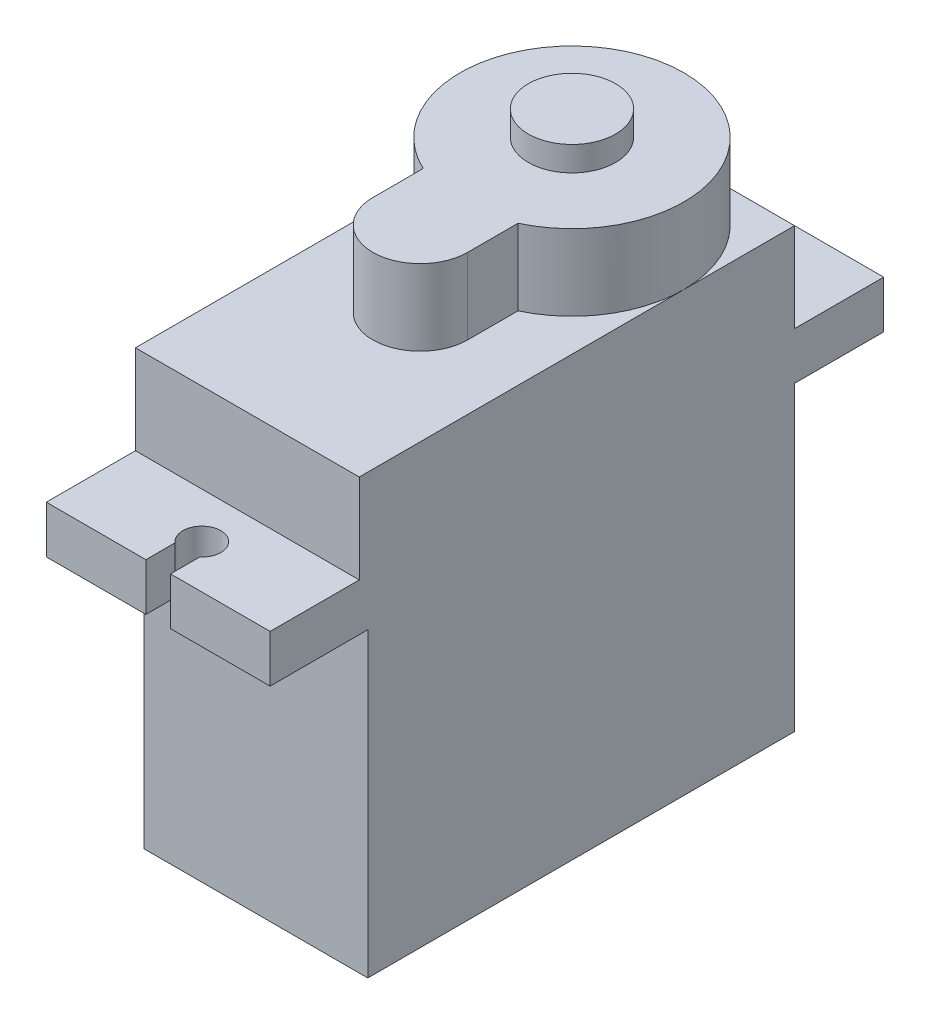
ISO-10303-21;
HEADER;
FILE_DESCRIPTION(('STEP AP214'),'2;1');
FILE_NAME('part.step','',(''),(''),'','','');
FILE_SCHEMA(('AUTOMOTIVE_DESIGN { 1 0 10303 214 1 1 1 1 }'));
ENDSEC;
DATA;
#1=APPLICATION_CONTEXT('core data for automotive mechanical design processes');
#2=APPLICATION_PROTOCOL_DEFINITION('international standard','automotive_design',2000,#1);
#3=PRODUCT_CONTEXT('',#1,'mechanical');
#4=PRODUCT('Part','Part','',(#3));
#5=PRODUCT_RELATED_PRODUCT_CATEGORY('part','',(#4));
#6=PRODUCT_DEFINITION_FORMATION('','',#4);
#7=PRODUCT_DEFINITION_CONTEXT('part definition',#1,'design');
#8=PRODUCT_DEFINITION('design','',#6,#7);
#9=PRODUCT_DEFINITION_SHAPE('','',#8);
#10=(LENGTH_UNIT() NAMED_UNIT(*) SI_UNIT(.MILLI.,.METRE.));
#11=(NAMED_UNIT(*) PLANE_ANGLE_UNIT() SI_UNIT($,.RADIAN.));
#12=(NAMED_UNIT(*) SI_UNIT($,.STERADIAN.) SOLID_ANGLE_UNIT());
#13=UNCERTAINTY_MEASURE_WITH_UNIT(LENGTH_MEASURE(1.E-05),#10,'distance_accuracy_value','');
#14=(GEOMETRIC_REPRESENTATION_CONTEXT(3) GLOBAL_UNCERTAINTY_ASSIGNED_CONTEXT((#13)) GLOBAL_UNIT_ASSIGNED_CONTEXT((#10,
#11,#12)) REPRESENTATION_CONTEXT('',''));
#15=CARTESIAN_POINT('',(0.,0.,0.));
#16=DIRECTION('',(0.,0.,1.));
#17=DIRECTION('',(1.,0.,0.));
#18=AXIS2_PLACEMENT_3D('',#15,#16,#17);
#19=CARTESIAN_POINT('',(11.8,18.4,-2.28295744158988));
#20=DIRECTION('',(0.,0.,-1.));
#21=DIRECTION('',(-1.,0.,0.));
#22=AXIS2_PLACEMENT_3D('',#19,#20,#21);
#23=PLANE('',#22);
#24=DIRECTION('',(-1.,0.,0.));
#25=VECTOR('',#24,1.);
#26=CARTESIAN_POINT('',(11.8,18.4,-2.28295744158988));
#27=LINE('',#26,#25);
#28=CARTESIAN_POINT('',(11.8,18.4,-2.28295744158988));
#29=VERTEX_POINT('',#28);
#30=CARTESIAN_POINT('',(6.55,18.4,-2.28295744158988));
#31=VERTEX_POINT('',#30);
#32=EDGE_CURVE('E369',#29,#31,#27,.T.);
#33=ORIENTED_EDGE('',*,*,#32,.T.);
#34=DIRECTION('',(0.,1.,0.));
#35=VECTOR('',#34,1.);
#36=CARTESIAN_POINT('',(6.55,8.4,-2.28295744158988));
#37=LINE('',#36,#35);
#38=CARTESIAN_POINT('',(6.55,15.9,-2.28295744158988));
#39=VERTEX_POINT('',#38);
#40=EDGE_CURVE('E225',#39,#31,#37,.T.);
#41=ORIENTED_EDGE('',*,*,#40,.F.);
#42=DIRECTION('',(-1.,0.,0.));
#43=VECTOR('',#42,1.);
#44=CARTESIAN_POINT('',(11.8,15.9,-2.28295744158988));
#45=LINE('',#44,#43);
#46=CARTESIAN_POINT('',(11.8,15.9,-2.28295744158988));
#47=VERTEX_POINT('',#46);
#48=EDGE_CURVE('E365',#47,#39,#45,.T.);
#49=ORIENTED_EDGE('',*,*,#48,.F.);
#50=DIRECTION('',(0.,-1.,0.));
#51=VECTOR('',#50,1.);
#52=CARTESIAN_POINT('',(11.8,18.4,-2.28295744158988));
#53=LINE('',#52,#51);
#54=EDGE_CURVE('E327',#29,#47,#53,.T.);
#55=ORIENTED_EDGE('',*,*,#54,.F.);
#56=EDGE_LOOP('',(#33,#41,#49,#55));
#57=FACE_BOUND('',#56,.T.);
#58=ADVANCED_FACE('F37',(#57),#23,.F.);
#59=CARTESIAN_POINT('',(11.8,15.9,-34.6322917276657));
#60=DIRECTION('',(0.,0.,1.));
#61=DIRECTION('',(1.,0.,0.));
#62=AXIS2_PLACEMENT_3D('',#59,#60,#61);
#63=PLANE('',#62);
#64=DIRECTION('',(-1.,0.,0.));
#65=VECTOR('',#64,1.);
#66=CARTESIAN_POINT('',(11.8,15.9,-34.6322917276657));
#67=LINE('',#66,#65);
#68=CARTESIAN_POINT('',(11.8,15.9,-34.6322917276657));
#69=VERTEX_POINT('',#68);
#70=CARTESIAN_POINT('',(6.55,15.9,-34.6322917276657));
#71=VERTEX_POINT('',#70);
#72=EDGE_CURVE('E390',#69,#71,#67,.T.);
#73=ORIENTED_EDGE('',*,*,#72,.T.);
#74=DIRECTION('',(0.,1.,0.));
#75=VECTOR('',#74,1.);
#76=CARTESIAN_POINT('',(6.55,8.4,-34.6322917276657));
#77=LINE('',#76,#75);
#78=CARTESIAN_POINT('',(6.55,18.4,-34.6322917276657));
#79=VERTEX_POINT('',#78);
#80=EDGE_CURVE('E247',#71,#79,#77,.T.);
#81=ORIENTED_EDGE('',*,*,#80,.T.);
#82=DIRECTION('',(-1.,0.,0.));
#83=VECTOR('',#82,1.);
#84=CARTESIAN_POINT('',(11.8,18.4,-34.6322917276657));
#85=LINE('',#84,#83);
#86=CARTESIAN_POINT('',(11.8,18.4,-34.6322917276657));
#87=VERTEX_POINT('',#86);
#88=EDGE_CURVE('E386',#87,#79,#85,.T.);
#89=ORIENTED_EDGE('',*,*,#88,.F.);
#90=DIRECTION('',(0.,1.,0.));
#91=VECTOR('',#90,1.);
#92=CARTESIAN_POINT('',(11.8,15.9,-34.6322917276657));
#93=LINE('',#92,#91);
#94=EDGE_CURVE('E313',#69,#87,#93,.T.);
#95=ORIENTED_EDGE('',*,*,#94,.F.);
#96=EDGE_LOOP('',(#73,#81,#89,#95));
#97=FACE_BOUND('',#96,.T.);
#98=ADVANCED_FACE('F480',(#97),#63,.F.);
#99=CARTESIAN_POINT('',(5.9,27.1,-16.0980374377126));
#100=DIRECTION('',(0.,1.,0.));
#101=DIRECTION('',(0.,0.,1.));
#102=AXIS2_PLACEMENT_3D('',#99,#100,#101);
#103=PLANE('',#102);
#104=CARTESIAN_POINT('',(5.9,27.1,-16.0980374377126));
#105=DIRECTION('',(0.,1.,0.));
#106=DIRECTION('',(0.,0.,1.));
#107=AXIS2_PLACEMENT_3D('',#104,#105,#106);
#108=CIRCLE('',#107,2.5);
#109=CARTESIAN_POINT('',(3.4,27.1,-16.0980374377126));
#110=VERTEX_POINT('',#109);
#111=CARTESIAN_POINT('',(8.4,27.1,-16.0980374377126));
#112=VERTEX_POINT('',#111);
#113=EDGE_CURVE('E267',#110,#112,#108,.T.);
#114=ORIENTED_EDGE('',*,*,#113,.T.);
#115=DIRECTION('',(0.,0.,-1.));
#116=VECTOR('',#115,1.);
#117=CARTESIAN_POINT('',(8.4,27.1,-16.0980374377126));
#118=LINE('',#117,#116);
#119=CARTESIAN_POINT('',(8.4,27.1,-18.7538817513576));
#120=VERTEX_POINT('',#119);
#121=EDGE_CURVE('E270',#112,#120,#118,.T.);
#122=ORIENTED_EDGE('',*,*,#121,.T.);
#123=CARTESIAN_POINT('',(5.9,27.1,-24.0980374377126));
#124=DIRECTION('',(0.,1.,0.));
#125=DIRECTION('',(0.,0.,1.));
#126=AXIS2_PLACEMENT_3D('',#123,#124,#125);
#127=CIRCLE('',#126,5.9);
#128=CARTESIAN_POINT('',(3.4,27.1,-18.7538817513576));
#129=VERTEX_POINT('',#128);
#130=EDGE_CURVE('E273',#120,#129,#127,.T.);
#131=ORIENTED_EDGE('',*,*,#130,.T.);
#132=DIRECTION('',(0.,0.,1.));
#133=VECTOR('',#132,1.);
#134=CARTESIAN_POINT('',(3.4,27.1,-16.0980374377126));
#135=LINE('',#134,#133);
#136=EDGE_CURVE('E275',#129,#110,#135,.T.);
#137=ORIENTED_EDGE('',*,*,#136,.T.);
#138=EDGE_LOOP('',(#114,#122,#131,#137));
#139=FACE_BOUND('',#138,.T.);
#140=CARTESIAN_POINT('',(5.9,27.1,-24.0980374377126));
#141=DIRECTION('',(0.,1.,0.));
#142=DIRECTION('',(0.,0.,1.));
#143=AXIS2_PLACEMENT_3D('',#140,#141,#142);
#144=CIRCLE('',#143,2.3);
#145=CARTESIAN_POINT('',(5.9,27.1,-21.7980374377126));
#146=VERTEX_POINT('',#145);
#147=EDGE_CURVE('E264',#146,#146,#144,.T.);
#148=ORIENTED_EDGE('',*,*,#147,.F.);
#149=EDGE_LOOP('',(#148));
#150=FACE_BOUND('',#149,.T.);
#151=ADVANCED_FACE('F485',(#139,#150),#103,.T.);
#152=CARTESIAN_POINT('',(11.8,23.1,-29.9322917276657));
#153=DIRECTION('',(0.,-1.,0.));
#154=DIRECTION('',(0.,0.,-1.));
#155=AXIS2_PLACEMENT_3D('',#152,#153,#154);
#156=PLANE('',#155);
#157=CARTESIAN_POINT('',(5.9,23.1,-24.0980374377126));
#158=DIRECTION('',(0.,1.,0.));
#159=DIRECTION('',(0.,0.,1.));
#160=AXIS2_PLACEMENT_3D('',#157,#158,#159);
#161=CIRCLE('',#160,5.9);
#162=CARTESIAN_POINT('',(5.02166243381931,23.1,-29.9322917276657));
#163=VERTEX_POINT('',#162);
#164=CARTESIAN_POINT('',(0.,23.1,-24.0980374377126));
#165=VERTEX_POINT('',#164);
#166=EDGE_CURVE('E403',#163,#165,#161,.T.);
#167=ORIENTED_EDGE('',*,*,#166,.F.);
#168=DIRECTION('',(-1.,0.,0.));
#169=VECTOR('',#168,1.);
#170=CARTESIAN_POINT('',(11.8,23.1,-29.9322917276657));
#171=LINE('',#170,#169);
#172=CARTESIAN_POINT('',(0.,23.1,-29.9322917276657));
#173=VERTEX_POINT('',#172);
#174=EDGE_CURVE('E377',#163,#173,#171,.T.);
#175=ORIENTED_EDGE('',*,*,#174,.T.);
#176=DIRECTION('',(0.,0.,1.));
#177=VECTOR('',#176,1.);
#178=CARTESIAN_POINT('',(0.,23.1,-29.9322917276657));
#179=LINE('',#178,#177);
#180=EDGE_CURVE('E350',#173,#165,#179,.T.);
#181=ORIENTED_EDGE('',*,*,#180,.T.);
#182=EDGE_LOOP('',(#167,#175,#181));
#183=FACE_BOUND('',#182,.T.);
#184=ADVANCED_FACE('F443',(#183),#156,.F.);
#185=CARTESIAN_POINT('',(3.4,23.1,-18.7538817513576));
#186=VERTEX_POINT('',#185);
#187=EDGE_CURVE('E450',#165,#186,#161,.T.);
#188=ORIENTED_EDGE('',*,*,#187,.F.);
#189=CARTESIAN_POINT('',(0.,23.1,-6.98295744158988));
#190=VERTEX_POINT('',#189);
#191=EDGE_CURVE('E349',#165,#190,#179,.T.);
#192=ORIENTED_EDGE('',*,*,#191,.T.);
#193=DIRECTION('',(-1.,0.,0.));
#194=VECTOR('',#193,1.);
#195=CARTESIAN_POINT('',(11.8,23.1,-6.98295744158988));
#196=LINE('',#195,#194);
#197=CARTESIAN_POINT('',(11.8,23.1,-6.98295744158988));
#198=VERTEX_POINT('',#197);
#199=EDGE_CURVE('E374',#198,#190,#196,.T.);
#200=ORIENTED_EDGE('',*,*,#199,.F.);
#201=DIRECTION('',(0.,0.,1.));
#202=VECTOR('',#201,1.);
#203=CARTESIAN_POINT('',(11.8,23.1,-29.9322917276657));
#204=LINE('',#203,#202);
#205=CARTESIAN_POINT('',(11.8,23.1,-24.0980374377126));
#206=VERTEX_POINT('',#205);
#207=EDGE_CURVE('E319',#206,#198,#204,.T.);
#208=ORIENTED_EDGE('',*,*,#207,.F.);
#209=CARTESIAN_POINT('',(8.4,23.1,-18.7538817513576));
#210=VERTEX_POINT('',#209);
#211=EDGE_CURVE('E285',#210,#206,#161,.T.);
#212=ORIENTED_EDGE('',*,*,#211,.F.);
#213=DIRECTION('',(0.,0.,-1.));
#214=VECTOR('',#213,1.);
#215=CARTESIAN_POINT('',(8.4,23.1,-16.0980374377126));
#216=LINE('',#215,#214);
#217=CARTESIAN_POINT('',(8.4,23.1,-16.0980374377126));
#218=VERTEX_POINT('',#217);
#219=EDGE_CURVE('E281',#218,#210,#216,.T.);
#220=ORIENTED_EDGE('',*,*,#219,.F.);
#221=CARTESIAN_POINT('',(5.9,23.1,-16.0980374377126));
#222=DIRECTION('',(0.,1.,0.));
#223=DIRECTION('',(0.,0.,1.));
#224=AXIS2_PLACEMENT_3D('',#221,#222,#223);
#225=CIRCLE('',#224,2.5);
#226=CARTESIAN_POINT('',(3.4,23.1,-16.0980374377126));
#227=VERTEX_POINT('',#226);
#228=EDGE_CURVE('E278',#227,#218,#225,.T.);
#229=ORIENTED_EDGE('',*,*,#228,.F.);
#230=DIRECTION('',(0.,0.,1.));
#231=VECTOR('',#230,1.);
#232=CARTESIAN_POINT('',(3.4,23.1,-16.0980374377126));
#233=LINE('',#232,#231);
#234=EDGE_CURVE('E271',#186,#227,#233,.T.);
#235=ORIENTED_EDGE('',*,*,#234,.F.);
#236=EDGE_LOOP('',(#188,#192,#200,#208,#212,#220,#229,#235));
#237=FACE_BOUND('',#236,.T.);
#238=ADVANCED_FACE('F457',(#237),#156,.F.);
#239=CARTESIAN_POINT('',(6.77833756618069,23.1,-29.9322917276657));
#240=VERTEX_POINT('',#239);
#241=EDGE_CURVE('E288',#206,#240,#161,.T.);
#242=ORIENTED_EDGE('',*,*,#241,.F.);
#243=CARTESIAN_POINT('',(11.8,23.1,-29.9322917276657));
#244=VERTEX_POINT('',#243);
#245=EDGE_CURVE('E320',#244,#206,#204,.T.);
#246=ORIENTED_EDGE('',*,*,#245,.F.);
#247=EDGE_CURVE('E378',#244,#240,#171,.T.);
#248=ORIENTED_EDGE('',*,*,#247,.T.);
#249=EDGE_LOOP('',(#242,#246,#248));
#250=FACE_BOUND('',#249,.T.);
#251=ADVANCED_FACE('F455',(#250),#156,.F.);
#252=CARTESIAN_POINT('',(11.8,15.9,-7.43229172766566));
#253=DIRECTION('',(0.,0.,-1.));
#254=DIRECTION('',(-1.,0.,0.));
#255=AXIS2_PLACEMENT_3D('',#252,#253,#254);
#256=PLANE('',#255);
#257=DIRECTION('',(0.,-1.,0.));
#258=VECTOR('',#257,1.);
#259=CARTESIAN_POINT('',(0.,15.9,-7.43229172766566));
#260=LINE('',#259,#258);
#261=CARTESIAN_POINT('',(0.,15.9,-7.43229172766566));
#262=VERTEX_POINT('',#261);
#263=CARTESIAN_POINT('',(0.,0.,-7.43229172766566));
#264=VERTEX_POINT('',#263);
#265=EDGE_CURVE('E302',#262,#264,#260,.T.);
#266=ORIENTED_EDGE('',*,*,#265,.T.);
#267=DIRECTION('',(-1.,0.,0.));
#268=VECTOR('',#267,1.);
#269=CARTESIAN_POINT('',(11.8,0.,-7.43229172766566));
#270=LINE('',#269,#268);
#271=CARTESIAN_POINT('',(11.8,0.,-7.43229172766566));
#272=VERTEX_POINT('',#271);
#273=EDGE_CURVE('E399',#272,#264,#270,.T.);
#274=ORIENTED_EDGE('',*,*,#273,.F.);
#275=DIRECTION('',(0.,-1.,0.));
#276=VECTOR('',#275,1.);
#277=CARTESIAN_POINT('',(11.8,15.9,-7.43229172766566));
#278=LINE('',#277,#276);
#279=CARTESIAN_POINT('',(11.8,15.9,-7.43229172766566));
#280=VERTEX_POINT('',#279);
#281=EDGE_CURVE('E303',#280,#272,#278,.T.);
#282=ORIENTED_EDGE('',*,*,#281,.F.);
#283=DIRECTION('',(-1.,0.,0.));
#284=VECTOR('',#283,1.);
#285=CARTESIAN_POINT('',(11.8,15.9,-7.43229172766566));
#286=LINE('',#285,#284);
#287=EDGE_CURVE('E331',#280,#262,#286,.T.);
#288=ORIENTED_EDGE('',*,*,#287,.T.);
#289=EDGE_LOOP('',(#266,#274,#282,#288));
#290=FACE_BOUND('',#289,.T.);
#291=ADVANCED_FACE('F421',(#290),#256,.F.);
#292=CARTESIAN_POINT('',(11.8,0.,-7.43229172766566));
#293=DIRECTION('',(0.,1.,0.));
#294=DIRECTION('',(0.,0.,1.));
#295=AXIS2_PLACEMENT_3D('',#292,#293,#294);
#296=PLANE('',#295);
#297=DIRECTION('',(0.,0.,-1.));
#298=VECTOR('',#297,1.);
#299=CARTESIAN_POINT('',(0.,0.,-7.43229172766566));
#300=LINE('',#299,#298);
#301=CARTESIAN_POINT('',(0.,0.,-29.9322917276657));
#302=VERTEX_POINT('',#301);
#303=EDGE_CURVE('E334',#264,#302,#300,.T.);
#304=ORIENTED_EDGE('',*,*,#303,.T.);
#305=DIRECTION('',(-1.,0.,0.));
#306=VECTOR('',#305,1.);
#307=CARTESIAN_POINT('',(11.8,0.,-29.9322917276657));
#308=LINE('',#307,#306);
#309=CARTESIAN_POINT('',(11.8,0.,-29.9322917276657));
#310=VERTEX_POINT('',#309);
#311=EDGE_CURVE('E396',#310,#302,#308,.T.);
#312=ORIENTED_EDGE('',*,*,#311,.F.);
#313=DIRECTION('',(0.,0.,-1.));
#314=VECTOR('',#313,1.);
#315=CARTESIAN_POINT('',(11.8,0.,-7.43229172766566));
#316=LINE('',#315,#314);
#317=EDGE_CURVE('E306',#272,#310,#316,.T.);
#318=ORIENTED_EDGE('',*,*,#317,.F.);
#319=ORIENTED_EDGE('',*,*,#273,.T.);
#320=EDGE_LOOP('',(#304,#312,#318,#319));
#321=FACE_BOUND('',#320,.T.);
#322=ADVANCED_FACE('F518',(#321),#296,.F.);
#323=CARTESIAN_POINT('',(11.8,0.,-29.9322917276657));
#324=DIRECTION('',(0.,0.,1.));
#325=DIRECTION('',(1.,0.,0.));
#326=AXIS2_PLACEMENT_3D('',#323,#324,#325);
#327=PLANE('',#326);
#328=DIRECTION('',(0.,1.,0.));
#329=VECTOR('',#328,1.);
#330=CARTESIAN_POINT('',(0.,0.,-29.9322917276657));
#331=LINE('',#330,#329);
#332=CARTESIAN_POINT('',(0.,15.9,-29.9322917276657));
#333=VERTEX_POINT('',#332);
#334=EDGE_CURVE('E336',#302,#333,#331,.T.);
#335=ORIENTED_EDGE('',*,*,#334,.T.);
#336=DIRECTION('',(-1.,0.,0.));
#337=VECTOR('',#336,1.);
#338=CARTESIAN_POINT('',(11.8,15.9,-29.9322917276657));
#339=LINE('',#338,#337);
#340=CARTESIAN_POINT('',(11.8,15.9,-29.9322917276657));
#341=VERTEX_POINT('',#340);
#342=EDGE_CURVE('E393',#341,#333,#339,.T.);
#343=ORIENTED_EDGE('',*,*,#342,.F.);
#344=DIRECTION('',(0.,1.,0.));
#345=VECTOR('',#344,1.);
#346=CARTESIAN_POINT('',(11.8,0.,-29.9322917276657));
#347=LINE('',#346,#345);
#348=EDGE_CURVE('E309',#310,#341,#347,.T.);
#349=ORIENTED_EDGE('',*,*,#348,.F.);
#350=ORIENTED_EDGE('',*,*,#311,.T.);
#351=EDGE_LOOP('',(#335,#343,#349,#350));
#352=FACE_BOUND('',#351,.T.);
#353=ADVANCED_FACE('F514',(#352),#327,.F.);
#354=CARTESIAN_POINT('',(11.8,15.9,-29.9322917276657));
#355=DIRECTION('',(0.,1.,0.));
#356=DIRECTION('',(0.,0.,1.));
#357=AXIS2_PLACEMENT_3D('',#354,#355,#356);
#358=PLANE('',#357);
#359=CARTESIAN_POINT('',(5.9,15.9,-32.3322917276657));
#360=DIRECTION('',(0.,1.,0.));
#361=DIRECTION('',(0.,0.,1.));
#362=AXIS2_PLACEMENT_3D('',#359,#360,#361);
#363=CIRCLE('',#362,0.999999999999998);
#364=CARTESIAN_POINT('',(5.25,15.9,-33.0922259353442));
#365=VERTEX_POINT('',#364);
#366=CARTESIAN_POINT('',(6.55,15.9,-33.0922259353442));
#367=VERTEX_POINT('',#366);
#368=EDGE_CURVE('E258',#365,#367,#363,.T.);
#369=ORIENTED_EDGE('',*,*,#368,.T.);
#370=DIRECTION('',(0.,0.,-1.));
#371=VECTOR('',#370,1.);
#372=CARTESIAN_POINT('',(6.55,15.9,-29.9322917276657));
#373=LINE('',#372,#371);
#374=EDGE_CURVE('E261',#367,#71,#373,.T.);
#375=ORIENTED_EDGE('',*,*,#374,.T.);
#376=ORIENTED_EDGE('',*,*,#72,.F.);
#377=DIRECTION('',(0.,0.,-1.));
#378=VECTOR('',#377,1.);
#379=CARTESIAN_POINT('',(11.8,15.9,-29.9322917276657));
#380=LINE('',#379,#378);
#381=EDGE_CURVE('E311',#341,#69,#380,.T.);
#382=ORIENTED_EDGE('',*,*,#381,.F.);
#383=ORIENTED_EDGE('',*,*,#342,.T.);
#384=DIRECTION('',(0.,0.,-1.));
#385=VECTOR('',#384,1.);
#386=CARTESIAN_POINT('',(0.,15.9,-29.9322917276657));
#387=LINE('',#386,#385);
#388=CARTESIAN_POINT('',(0.,15.9,-34.6322917276657));
#389=VERTEX_POINT('',#388);
#390=EDGE_CURVE('E338',#333,#389,#387,.T.);
#391=ORIENTED_EDGE('',*,*,#390,.T.);
#392=CARTESIAN_POINT('',(5.25,15.9,-34.6322917276657));
#393=VERTEX_POINT('',#392);
#394=EDGE_CURVE('E389',#393,#389,#67,.T.);
#395=ORIENTED_EDGE('',*,*,#394,.F.);
#396=DIRECTION('',(0.,0.,1.));
#397=VECTOR('',#396,1.);
#398=CARTESIAN_POINT('',(5.25,15.9,-29.9322917276657));
#399=LINE('',#398,#397);
#400=EDGE_CURVE('E250',#393,#365,#399,.T.);
#401=ORIENTED_EDGE('',*,*,#400,.T.);
#402=EDGE_LOOP('',(#369,#375,#376,#382,#383,#391,#395,#401));
#403=FACE_BOUND('',#402,.T.);
#404=ADVANCED_FACE('F510',(#403),#358,.F.);
#405=CARTESIAN_POINT('',(5.25,18.4,-34.6322917276657));
#406=VERTEX_POINT('',#405);
#407=CARTESIAN_POINT('',(0.,18.4,-34.6322917276657));
#408=VERTEX_POINT('',#407);
#409=EDGE_CURVE('E385',#406,#408,#85,.T.);
#410=ORIENTED_EDGE('',*,*,#409,.F.);
#411=DIRECTION('',(0.,1.,0.));
#412=VECTOR('',#411,1.);
#413=CARTESIAN_POINT('',(5.25,8.4,-34.6322917276657));
#414=LINE('',#413,#412);
#415=EDGE_CURVE('E61',#393,#406,#414,.T.);
#416=ORIENTED_EDGE('',*,*,#415,.F.);
#417=ORIENTED_EDGE('',*,*,#394,.T.);
#418=DIRECTION('',(0.,1.,0.));
#419=VECTOR('',#418,1.);
#420=CARTESIAN_POINT('',(0.,15.9,-34.6322917276657));
#421=LINE('',#420,#419);
#422=EDGE_CURVE('E341',#389,#408,#421,.T.);
#423=ORIENTED_EDGE('',*,*,#422,.T.);
#424=EDGE_LOOP('',(#410,#416,#417,#423));
#425=FACE_BOUND('',#424,.T.);
#426=ADVANCED_FACE('F488',(#425),#63,.F.);
#427=CARTESIAN_POINT('',(11.8,18.4,-34.6322917276657));
#428=DIRECTION('',(0.,-1.,0.));
#429=DIRECTION('',(0.,0.,-1.));
#430=AXIS2_PLACEMENT_3D('',#427,#428,#429);
#431=PLANE('',#430);
#432=ORIENTED_EDGE('',*,*,#88,.T.);
#433=DIRECTION('',(0.,0.,-1.));
#434=VECTOR('',#433,1.);
#435=CARTESIAN_POINT('',(6.55,18.4,-34.6322917276657));
#436=LINE('',#435,#434);
#437=CARTESIAN_POINT('',(6.55,18.4,-33.0922259353442));
#438=VERTEX_POINT('',#437);
#439=EDGE_CURVE('E236',#438,#79,#436,.T.);
#440=ORIENTED_EDGE('',*,*,#439,.F.);
#441=CARTESIAN_POINT('',(5.9,18.4,-32.3322917276657));
#442=DIRECTION('',(0.,1.,0.));
#443=DIRECTION('',(0.,0.,1.));
#444=AXIS2_PLACEMENT_3D('',#441,#442,#443);
#445=CIRCLE('',#444,0.999999999999998);
#446=CARTESIAN_POINT('',(5.25,18.4,-33.0922259353442));
#447=VERTEX_POINT('',#446);
#448=EDGE_CURVE('E244',#447,#438,#445,.T.);
#449=ORIENTED_EDGE('',*,*,#448,.F.);
#450=DIRECTION('',(0.,0.,1.));
#451=VECTOR('',#450,1.);
#452=CARTESIAN_POINT('',(5.25,18.4,-34.6322917276657));
#453=LINE('',#452,#451);
#454=EDGE_CURVE('E242',#406,#447,#453,.T.);
#455=ORIENTED_EDGE('',*,*,#454,.F.);
#456=ORIENTED_EDGE('',*,*,#409,.T.);
#457=DIRECTION('',(0.,0.,1.));
#458=VECTOR('',#457,1.);
#459=CARTESIAN_POINT('',(0.,18.4,-34.6322917276657));
#460=LINE('',#459,#458);
#461=CARTESIAN_POINT('',(0.,18.4,-29.9322917276657));
#462=VERTEX_POINT('',#461);
#463=EDGE_CURVE('E344',#408,#462,#460,.T.);
#464=ORIENTED_EDGE('',*,*,#463,.T.);
#465=DIRECTION('',(-1.,0.,0.));
#466=VECTOR('',#465,1.);
#467=CARTESIAN_POINT('',(11.8,18.4,-29.9322917276657));
#468=LINE('',#467,#466);
#469=CARTESIAN_POINT('',(11.8,18.4,-29.9322917276657));
#470=VERTEX_POINT('',#469);
#471=EDGE_CURVE('E381',#470,#462,#468,.T.);
#472=ORIENTED_EDGE('',*,*,#471,.F.);
#473=DIRECTION('',(0.,0.,1.));
#474=VECTOR('',#473,1.);
#475=CARTESIAN_POINT('',(11.8,18.4,-34.6322917276657));
#476=LINE('',#475,#474);
#477=EDGE_CURVE('E315',#87,#470,#476,.T.);
#478=ORIENTED_EDGE('',*,*,#477,.F.);
#479=EDGE_LOOP('',(#432,#440,#449,#455,#456,#464,#472,#478));
#480=FACE_BOUND('',#479,.T.);
#481=ADVANCED_FACE('F505',(#480),#431,.F.);
#482=CARTESIAN_POINT('',(11.8,18.4,-29.9322917276657));
#483=DIRECTION('',(0.,0.,1.));
#484=DIRECTION('',(1.,0.,0.));
#485=AXIS2_PLACEMENT_3D('',#482,#483,#484);
#486=PLANE('',#485);
#487=DIRECTION('',(0.,1.,0.));
#488=VECTOR('',#487,1.);
#489=CARTESIAN_POINT('',(0.,18.4,-29.9322917276657));
#490=LINE('',#489,#488);
#491=EDGE_CURVE('E346',#462,#173,#490,.T.);
#492=ORIENTED_EDGE('',*,*,#491,.T.);
#493=ORIENTED_EDGE('',*,*,#174,.F.);
#494=EDGE_CURVE('E382',#240,#163,#171,.T.);
#495=ORIENTED_EDGE('',*,*,#494,.F.);
#496=ORIENTED_EDGE('',*,*,#247,.F.);
#497=DIRECTION('',(0.,1.,0.));
#498=VECTOR('',#497,1.);
#499=CARTESIAN_POINT('',(11.8,18.4,-29.9322917276657));
#500=LINE('',#499,#498);
#501=EDGE_CURVE('E317',#470,#244,#500,.T.);
#502=ORIENTED_EDGE('',*,*,#501,.F.);
#503=ORIENTED_EDGE('',*,*,#471,.T.);
#504=EDGE_LOOP('',(#492,#493,#495,#496,#502,#503));
#505=FACE_BOUND('',#504,.T.);
#506=ADVANCED_FACE('F462',(#505),#486,.F.);
#507=CARTESIAN_POINT('',(11.8,23.1,-6.98295744158988));
#508=DIRECTION('',(0.,0.,-1.));
#509=DIRECTION('',(-1.,0.,0.));
#510=AXIS2_PLACEMENT_3D('',#507,#508,#509);
#511=PLANE('',#510);
#512=DIRECTION('',(0.,-1.,0.));
#513=VECTOR('',#512,1.);
#514=CARTESIAN_POINT('',(0.,23.1,-6.98295744158988));
#515=LINE('',#514,#513);
#516=CARTESIAN_POINT('',(0.,18.4,-6.98295744158988));
#517=VERTEX_POINT('',#516);
#518=EDGE_CURVE('E353',#190,#517,#515,.T.);
#519=ORIENTED_EDGE('',*,*,#518,.T.);
#520=DIRECTION('',(-1.,0.,0.));
#521=VECTOR('',#520,1.);
#522=CARTESIAN_POINT('',(11.8,18.4,-6.98295744158988));
#523=LINE('',#522,#521);
#524=CARTESIAN_POINT('',(11.8,18.4,-6.98295744158988));
#525=VERTEX_POINT('',#524);
#526=EDGE_CURVE('E371',#525,#517,#523,.T.);
#527=ORIENTED_EDGE('',*,*,#526,.F.);
#528=DIRECTION('',(0.,-1.,0.));
#529=VECTOR('',#528,1.);
#530=CARTESIAN_POINT('',(11.8,23.1,-6.98295744158988));
#531=LINE('',#530,#529);
#532=EDGE_CURVE('E323',#198,#525,#531,.T.);
#533=ORIENTED_EDGE('',*,*,#532,.F.);
#534=ORIENTED_EDGE('',*,*,#199,.T.);
#535=EDGE_LOOP('',(#519,#527,#533,#534));
#536=FACE_BOUND('',#535,.T.);
#537=ADVANCED_FACE('F435',(#536),#511,.F.);
#538=CARTESIAN_POINT('',(11.8,18.4,-6.98295744158988));
#539=DIRECTION('',(0.,-1.,0.));
#540=DIRECTION('',(0.,0.,-1.));
#541=AXIS2_PLACEMENT_3D('',#538,#539,#540);
#542=PLANE('',#541);
#543=CARTESIAN_POINT('',(5.9,18.4,-4.58295744158988));
#544=DIRECTION('',(0.,1.,0.));
#545=DIRECTION('',(0.,0.,1.));
#546=AXIS2_PLACEMENT_3D('',#543,#544,#545);
#547=CIRCLE('',#546,1.);
#548=CARTESIAN_POINT('',(6.55,18.4,-3.82302323391134));
#549=VERTEX_POINT('',#548);
#550=CARTESIAN_POINT('',(5.25,18.4,-3.82302323391135));
#551=VERTEX_POINT('',#550);
#552=EDGE_CURVE('E214',#549,#551,#547,.T.);
#553=ORIENTED_EDGE('',*,*,#552,.F.);
#554=DIRECTION('',(0.,0.,-1.));
#555=VECTOR('',#554,1.);
#556=CARTESIAN_POINT('',(6.55,18.4,-2.28295744158988));
#557=LINE('',#556,#555);
#558=EDGE_CURVE('E222',#31,#549,#557,.T.);
#559=ORIENTED_EDGE('',*,*,#558,.F.);
#560=ORIENTED_EDGE('',*,*,#32,.F.);
#561=DIRECTION('',(0.,0.,1.));
#562=VECTOR('',#561,1.);
#563=CARTESIAN_POINT('',(11.8,18.4,-6.98295744158988));
#564=LINE('',#563,#562);
#565=EDGE_CURVE('E325',#525,#29,#564,.T.);
#566=ORIENTED_EDGE('',*,*,#565,.F.);
#567=ORIENTED_EDGE('',*,*,#526,.T.);
#568=DIRECTION('',(0.,0.,1.));
#569=VECTOR('',#568,1.);
#570=CARTESIAN_POINT('',(0.,18.4,-6.98295744158988));
#571=LINE('',#570,#569);
#572=CARTESIAN_POINT('',(0.,18.4,-2.28295744158988));
#573=VERTEX_POINT('',#572);
#574=EDGE_CURVE('E355',#517,#573,#571,.T.);
#575=ORIENTED_EDGE('',*,*,#574,.T.);
#576=CARTESIAN_POINT('',(5.25,18.4,-2.28295744158988));
#577=VERTEX_POINT('',#576);
#578=EDGE_CURVE('E368',#577,#573,#27,.T.);
#579=ORIENTED_EDGE('',*,*,#578,.F.);
#580=DIRECTION('',(0.,0.,1.));
#581=VECTOR('',#580,1.);
#582=CARTESIAN_POINT('',(5.25,18.4,-2.28295744158988));
#583=LINE('',#582,#581);
#584=EDGE_CURVE('E219',#551,#577,#583,.T.);
#585=ORIENTED_EDGE('',*,*,#584,.F.);
#586=EDGE_LOOP('',(#553,#559,#560,#566,#567,#575,#579,#585));
#587=FACE_BOUND('',#586,.T.);
#588=ADVANCED_FACE('F230',(#587),#542,.F.);
#589=CARTESIAN_POINT('',(5.25,15.9,-2.28295744158988));
#590=VERTEX_POINT('',#589);
#591=CARTESIAN_POINT('',(0.,15.9,-2.28295744158988));
#592=VERTEX_POINT('',#591);
#593=EDGE_CURVE('E364',#590,#592,#45,.T.);
#594=ORIENTED_EDGE('',*,*,#593,.F.);
#595=DIRECTION('',(0.,1.,0.));
#596=VECTOR('',#595,1.);
#597=CARTESIAN_POINT('',(5.25,8.4,-2.28295744158988));
#598=LINE('',#597,#596);
#599=EDGE_CURVE('E237',#590,#577,#598,.T.);
#600=ORIENTED_EDGE('',*,*,#599,.T.);
#601=ORIENTED_EDGE('',*,*,#578,.T.);
#602=DIRECTION('',(0.,-1.,0.));
#603=VECTOR('',#602,1.);
#604=CARTESIAN_POINT('',(0.,18.4,-2.28295744158988));
#605=LINE('',#604,#603);
#606=EDGE_CURVE('E358',#573,#592,#605,.T.);
#607=ORIENTED_EDGE('',*,*,#606,.T.);
#608=EDGE_LOOP('',(#594,#600,#601,#607));
#609=FACE_BOUND('',#608,.T.);
#610=ADVANCED_FACE('F410',(#609),#23,.F.);
#611=CARTESIAN_POINT('',(11.8,15.9,-2.28295744158988));
#612=DIRECTION('',(0.,1.,0.));
#613=DIRECTION('',(0.,0.,1.));
#614=AXIS2_PLACEMENT_3D('',#611,#612,#613);
#615=PLANE('',#614);
#616=ORIENTED_EDGE('',*,*,#48,.T.);
#617=DIRECTION('',(0.,0.,-1.));
#618=VECTOR('',#617,1.);
#619=CARTESIAN_POINT('',(6.55,15.9,-2.28295744158988));
#620=LINE('',#619,#618);
#621=CARTESIAN_POINT('',(6.55,15.9,-3.82302323391134));
#622=VERTEX_POINT('',#621);
#623=EDGE_CURVE('E12',#39,#622,#620,.T.);
#624=ORIENTED_EDGE('',*,*,#623,.T.);
#625=CARTESIAN_POINT('',(5.9,15.9,-4.58295744158988));
#626=DIRECTION('',(0.,1.,0.));
#627=DIRECTION('',(0.,0.,1.));
#628=AXIS2_PLACEMENT_3D('',#625,#626,#627);
#629=CIRCLE('',#628,1.);
#630=CARTESIAN_POINT('',(5.25,15.9,-3.82302323391135));
#631=VERTEX_POINT('',#630);
#632=EDGE_CURVE('E217',#622,#631,#629,.T.);
#633=ORIENTED_EDGE('',*,*,#632,.T.);
#634=DIRECTION('',(0.,0.,1.));
#635=VECTOR('',#634,1.);
#636=CARTESIAN_POINT('',(5.25,15.9,-2.28295744158988));
#637=LINE('',#636,#635);
#638=EDGE_CURVE('E46',#631,#590,#637,.T.);
#639=ORIENTED_EDGE('',*,*,#638,.T.);
#640=ORIENTED_EDGE('',*,*,#593,.T.);
#641=DIRECTION('',(0.,0.,-1.));
#642=VECTOR('',#641,1.);
#643=CARTESIAN_POINT('',(0.,15.9,-2.28295744158988));
#644=LINE('',#643,#642);
#645=EDGE_CURVE('E307',#592,#262,#644,.T.);
#646=ORIENTED_EDGE('',*,*,#645,.T.);
#647=ORIENTED_EDGE('',*,*,#287,.F.);
#648=DIRECTION('',(0.,0.,-1.));
#649=VECTOR('',#648,1.);
#650=CARTESIAN_POINT('',(11.8,15.9,-2.28295744158988));
#651=LINE('',#650,#649);
#652=EDGE_CURVE('E329',#47,#280,#651,.T.);
#653=ORIENTED_EDGE('',*,*,#652,.F.);
#654=EDGE_LOOP('',(#616,#624,#633,#639,#640,#646,#647,#653));
#655=FACE_BOUND('',#654,.T.);
#656=ADVANCED_FACE('F407',(#655),#615,.F.);
#657=CARTESIAN_POINT('',(11.8,0.,-7.43229172766566));
#658=DIRECTION('',(1.,0.,0.));
#659=DIRECTION('',(0.,0.,-1.));
#660=AXIS2_PLACEMENT_3D('',#657,#658,#659);
#661=PLANE('',#660);
#662=ORIENTED_EDGE('',*,*,#281,.T.);
#663=ORIENTED_EDGE('',*,*,#317,.T.);
#664=ORIENTED_EDGE('',*,*,#348,.T.);
#665=ORIENTED_EDGE('',*,*,#381,.T.);
#666=ORIENTED_EDGE('',*,*,#94,.T.);
#667=ORIENTED_EDGE('',*,*,#477,.T.);
#668=ORIENTED_EDGE('',*,*,#501,.T.);
#669=ORIENTED_EDGE('',*,*,#245,.T.);
#670=ORIENTED_EDGE('',*,*,#207,.T.);
#671=ORIENTED_EDGE('',*,*,#532,.T.);
#672=ORIENTED_EDGE('',*,*,#565,.T.);
#673=ORIENTED_EDGE('',*,*,#54,.T.);
#674=ORIENTED_EDGE('',*,*,#652,.T.);
#675=EDGE_LOOP('',(#662,#663,#664,#665,#666,#667,#668,#669,#670,#671,#672,#673,#674));
#676=FACE_BOUND('',#675,.T.);
#677=ADVANCED_FACE('F424',(#676),#661,.T.);
#678=CARTESIAN_POINT('',(0.,0.,-7.43229172766566));
#679=DIRECTION('',(1.,0.,0.));
#680=DIRECTION('',(0.,0.,-1.));
#681=AXIS2_PLACEMENT_3D('',#678,#679,#680);
#682=PLANE('',#681);
#683=ORIENTED_EDGE('',*,*,#265,.F.);
#684=ORIENTED_EDGE('',*,*,#645,.F.);
#685=ORIENTED_EDGE('',*,*,#606,.F.);
#686=ORIENTED_EDGE('',*,*,#574,.F.);
#687=ORIENTED_EDGE('',*,*,#518,.F.);
#688=ORIENTED_EDGE('',*,*,#191,.F.);
#689=ORIENTED_EDGE('',*,*,#180,.F.);
#690=ORIENTED_EDGE('',*,*,#491,.F.);
#691=ORIENTED_EDGE('',*,*,#463,.F.);
#692=ORIENTED_EDGE('',*,*,#422,.F.);
#693=ORIENTED_EDGE('',*,*,#390,.F.);
#694=ORIENTED_EDGE('',*,*,#334,.F.);
#695=ORIENTED_EDGE('',*,*,#303,.F.);
#696=EDGE_LOOP('',(#683,#684,#685,#686,#687,#688,#689,#690,#691,#692,#693,#694,#695));
#697=FACE_BOUND('',#696,.T.);
#698=ADVANCED_FACE('F416',(#697),#682,.F.);
#699=CARTESIAN_POINT('',(5.9,23.1,-16.0980374377126));
#700=DIRECTION('',(0.,1.,0.));
#701=DIRECTION('',(0.,0.,1.));
#702=AXIS2_PLACEMENT_3D('',#699,#700,#701);
#703=PLANE('',#702);
#704=EDGE_CURVE('E284',#240,#163,#161,.T.);
#705=ORIENTED_EDGE('',*,*,#704,.F.);
#706=ORIENTED_EDGE('',*,*,#494,.T.);
#707=EDGE_LOOP('',(#705,#706));
#708=FACE_BOUND('',#707,.T.);
#709=ADVANCED_FACE('F465',(#708),#703,.F.);
#710=CARTESIAN_POINT('',(5.9,27.1,-16.0980374377126));
#711=DIRECTION('',(0.,-1.,0.));
#712=DIRECTION('',(0.,0.,-1.));
#713=AXIS2_PLACEMENT_3D('',#710,#711,#712);
#714=CYLINDRICAL_SURFACE('',#713,2.5);
#715=ORIENTED_EDGE('',*,*,#228,.T.);
#716=DIRECTION('',(0.,-1.,0.));
#717=VECTOR('',#716,1.);
#718=CARTESIAN_POINT('',(8.4,27.1,-16.0980374377126));
#719=LINE('',#718,#717);
#720=EDGE_CURVE('E299',#112,#218,#719,.T.);
#721=ORIENTED_EDGE('',*,*,#720,.F.);
#722=ORIENTED_EDGE('',*,*,#113,.F.);
#723=DIRECTION('',(0.,-1.,0.));
#724=VECTOR('',#723,1.);
#725=CARTESIAN_POINT('',(3.4,27.1,-16.0980374377126));
#726=LINE('',#725,#724);
#727=EDGE_CURVE('E277',#110,#227,#726,.T.);
#728=ORIENTED_EDGE('',*,*,#727,.T.);
#729=EDGE_LOOP('',(#715,#721,#722,#728));
#730=FACE_BOUND('',#729,.T.);
#731=ADVANCED_FACE('F467',(#730),#714,.T.);
#732=CARTESIAN_POINT('',(8.4,27.1,-16.0980374377126));
#733=DIRECTION('',(-1.,0.,0.));
#734=DIRECTION('',(0.,0.,1.));
#735=AXIS2_PLACEMENT_3D('',#732,#733,#734);
#736=PLANE('',#735);
#737=ORIENTED_EDGE('',*,*,#219,.T.);
#738=DIRECTION('',(0.,-1.,0.));
#739=VECTOR('',#738,1.);
#740=CARTESIAN_POINT('',(8.4,27.1,-18.7538817513576));
#741=LINE('',#740,#739);
#742=EDGE_CURVE('E296',#120,#210,#741,.T.);
#743=ORIENTED_EDGE('',*,*,#742,.F.);
#744=ORIENTED_EDGE('',*,*,#121,.F.);
#745=ORIENTED_EDGE('',*,*,#720,.T.);
#746=EDGE_LOOP('',(#737,#743,#744,#745));
#747=FACE_BOUND('',#746,.T.);
#748=ADVANCED_FACE('F473',(#747),#736,.F.);
#749=CARTESIAN_POINT('',(5.9,27.1,-24.0980374377126));
#750=DIRECTION('',(0.,-1.,0.));
#751=DIRECTION('',(0.,0.,-1.));
#752=AXIS2_PLACEMENT_3D('',#749,#750,#751);
#753=CYLINDRICAL_SURFACE('',#752,5.9);
#754=ORIENTED_EDGE('',*,*,#211,.T.);
#755=ORIENTED_EDGE('',*,*,#241,.T.);
#756=ORIENTED_EDGE('',*,*,#704,.T.);
#757=ORIENTED_EDGE('',*,*,#166,.T.);
#758=ORIENTED_EDGE('',*,*,#187,.T.);
#759=DIRECTION('',(0.,-1.,0.));
#760=VECTOR('',#759,1.);
#761=CARTESIAN_POINT('',(3.4,27.1,-18.7538817513576));
#762=LINE('',#761,#760);
#763=EDGE_CURVE('E293',#129,#186,#762,.T.);
#764=ORIENTED_EDGE('',*,*,#763,.F.);
#765=ORIENTED_EDGE('',*,*,#130,.F.);
#766=ORIENTED_EDGE('',*,*,#742,.T.);
#767=EDGE_LOOP('',(#754,#755,#756,#757,#758,#764,#765,#766));
#768=FACE_BOUND('',#767,.T.);
#769=ADVANCED_FACE('F448',(#768),#753,.T.);
#770=CARTESIAN_POINT('',(3.4,27.1,-16.0980374377126));
#771=DIRECTION('',(1.,0.,0.));
#772=DIRECTION('',(0.,0.,-1.));
#773=AXIS2_PLACEMENT_3D('',#770,#771,#772);
#774=PLANE('',#773);
#775=ORIENTED_EDGE('',*,*,#234,.T.);
#776=ORIENTED_EDGE('',*,*,#727,.F.);
#777=ORIENTED_EDGE('',*,*,#136,.F.);
#778=ORIENTED_EDGE('',*,*,#763,.T.);
#779=EDGE_LOOP('',(#775,#776,#777,#778));
#780=FACE_BOUND('',#779,.T.);
#781=ADVANCED_FACE('F652',(#780),#774,.F.);
#782=CARTESIAN_POINT('',(5.9,30.3,-24.0980374377126));
#783=DIRECTION('',(0.,-1.,0.));
#784=DIRECTION('',(0.,0.,-1.));
#785=AXIS2_PLACEMENT_3D('',#782,#783,#784);
#786=CYLINDRICAL_SURFACE('',#785,2.3);
#787=CARTESIAN_POINT('',(5.9,28.4,-24.0980374377126));
#788=DIRECTION('',(0.,1.,0.));
#789=DIRECTION('',(0.,0.,1.));
#790=AXIS2_PLACEMENT_3D('',#787,#788,#789);
#791=CIRCLE('',#790,2.3);
#792=CARTESIAN_POINT('',(5.9,28.4,-21.7980374377126));
#793=VERTEX_POINT('',#792);
#794=EDGE_CURVE('E41',#793,#793,#791,.T.);
#795=ORIENTED_EDGE('',*,*,#794,.F.);
#796=EDGE_LOOP('',(#795));
#797=FACE_BOUND('',#796,.T.);
#798=ORIENTED_EDGE('',*,*,#147,.T.);
#799=EDGE_LOOP('',(#798));
#800=FACE_BOUND('',#799,.T.);
#801=ADVANCED_FACE('F647',(#797,#800),#786,.T.);
#802=CARTESIAN_POINT('',(5.9,28.4,-24.0980374377126));
#803=DIRECTION('',(0.,1.,0.));
#804=DIRECTION('',(0.,0.,1.));
#805=AXIS2_PLACEMENT_3D('',#802,#803,#804);
#806=PLANE('',#805);
#807=ORIENTED_EDGE('',*,*,#794,.T.);
#808=EDGE_LOOP('',(#807));
#809=FACE_BOUND('',#808,.T.);
#810=ADVANCED_FACE('F39',(#809),#806,.T.);
#811=CARTESIAN_POINT('',(6.55,8.4,-34.6322917276657));
#812=DIRECTION('',(1.,0.,0.));
#813=DIRECTION('',(0.,0.,-1.));
#814=AXIS2_PLACEMENT_3D('',#811,#812,#813);
#815=PLANE('',#814);
#816=DIRECTION('',(0.,1.,0.));
#817=VECTOR('',#816,1.);
#818=CARTESIAN_POINT('',(6.55,8.4,-33.0922259353442));
#819=LINE('',#818,#817);
#820=EDGE_CURVE('E248',#367,#438,#819,.T.);
#821=ORIENTED_EDGE('',*,*,#820,.T.);
#822=ORIENTED_EDGE('',*,*,#439,.T.);
#823=ORIENTED_EDGE('',*,*,#80,.F.);
#824=ORIENTED_EDGE('',*,*,#374,.F.);
#825=EDGE_LOOP('',(#821,#822,#823,#824));
#826=FACE_BOUND('',#825,.T.);
#827=ADVANCED_FACE('F592',(#826),#815,.F.);
#828=CARTESIAN_POINT('',(5.9,8.4,-32.3322917276657));
#829=DIRECTION('',(0.,1.,0.));
#830=DIRECTION('',(0.,0.,1.));
#831=AXIS2_PLACEMENT_3D('',#828,#829,#830);
#832=CYLINDRICAL_SURFACE('',#831,0.999999999999998);
#833=DIRECTION('',(0.,1.,0.));
#834=VECTOR('',#833,1.);
#835=CARTESIAN_POINT('',(5.25,8.4,-33.0922259353442));
#836=LINE('',#835,#834);
#837=EDGE_CURVE('E251',#365,#447,#836,.T.);
#838=ORIENTED_EDGE('',*,*,#837,.T.);
#839=ORIENTED_EDGE('',*,*,#448,.T.);
#840=ORIENTED_EDGE('',*,*,#820,.F.);
#841=ORIENTED_EDGE('',*,*,#368,.F.);
#842=EDGE_LOOP('',(#838,#839,#840,#841));
#843=FACE_BOUND('',#842,.T.);
#844=ADVANCED_FACE('F597',(#843),#832,.F.);
#845=CARTESIAN_POINT('',(5.25,8.4,-34.6322917276657));
#846=DIRECTION('',(-1.,0.,0.));
#847=DIRECTION('',(0.,0.,1.));
#848=AXIS2_PLACEMENT_3D('',#845,#846,#847);
#849=PLANE('',#848);
#850=ORIENTED_EDGE('',*,*,#415,.T.);
#851=ORIENTED_EDGE('',*,*,#454,.T.);
#852=ORIENTED_EDGE('',*,*,#837,.F.);
#853=ORIENTED_EDGE('',*,*,#400,.F.);
#854=EDGE_LOOP('',(#850,#851,#852,#853));
#855=FACE_BOUND('',#854,.T.);
#856=ADVANCED_FACE('F608',(#855),#849,.F.);
#857=CARTESIAN_POINT('',(6.55,8.4,-2.28295744158988));
#858=DIRECTION('',(1.,0.,0.));
#859=DIRECTION('',(0.,0.,-1.));
#860=AXIS2_PLACEMENT_3D('',#857,#858,#859);
#861=PLANE('',#860);
#862=ORIENTED_EDGE('',*,*,#40,.T.);
#863=ORIENTED_EDGE('',*,*,#558,.T.);
#864=DIRECTION('',(0.,1.,0.));
#865=VECTOR('',#864,1.);
#866=CARTESIAN_POINT('',(6.55,8.4,-3.82302323391134));
#867=LINE('',#866,#865);
#868=EDGE_CURVE('E210',#622,#549,#867,.T.);
#869=ORIENTED_EDGE('',*,*,#868,.F.);
#870=ORIENTED_EDGE('',*,*,#623,.F.);
#871=EDGE_LOOP('',(#862,#863,#869,#870));
#872=FACE_BOUND('',#871,.T.);
#873=ADVANCED_FACE('F223',(#872),#861,.F.);
#874=CARTESIAN_POINT('',(5.25,8.4,-2.28295744158988));
#875=DIRECTION('',(-1.,0.,0.));
#876=DIRECTION('',(0.,0.,1.));
#877=AXIS2_PLACEMENT_3D('',#874,#875,#876);
#878=PLANE('',#877);
#879=DIRECTION('',(0.,1.,0.));
#880=VECTOR('',#879,1.);
#881=CARTESIAN_POINT('',(5.25,8.4,-3.82302323391135));
#882=LINE('',#881,#880);
#883=EDGE_CURVE('E53',#631,#551,#882,.T.);
#884=ORIENTED_EDGE('',*,*,#883,.T.);
#885=ORIENTED_EDGE('',*,*,#584,.T.);
#886=ORIENTED_EDGE('',*,*,#599,.F.);
#887=ORIENTED_EDGE('',*,*,#638,.F.);
#888=EDGE_LOOP('',(#884,#885,#886,#887));
#889=FACE_BOUND('',#888,.T.);
#890=ADVANCED_FACE('F626',(#889),#878,.F.);
#891=CARTESIAN_POINT('',(5.9,8.4,-4.58295744158988));
#892=DIRECTION('',(0.,1.,0.));
#893=DIRECTION('',(0.,0.,1.));
#894=AXIS2_PLACEMENT_3D('',#891,#892,#893);
#895=CYLINDRICAL_SURFACE('',#894,1.);
#896=ORIENTED_EDGE('',*,*,#868,.T.);
#897=ORIENTED_EDGE('',*,*,#552,.T.);
#898=ORIENTED_EDGE('',*,*,#883,.F.);
#899=ORIENTED_EDGE('',*,*,#632,.F.);
#900=EDGE_LOOP('',(#896,#897,#898,#899));
#901=FACE_BOUND('',#900,.T.);
#902=ADVANCED_FACE('F212',(#901),#895,.F.);
#903=CLOSED_SHELL('',(#58,#98,#151,#184,#238,#251,#291,#322,#353,#404,#426,#481,#506,#537,#588,
#610,#656,#677,#698,#709,#731,#748,#769,#781,#801,#810,#827,#844,#856,#873,#890,#902));
#904=MANIFOLD_SOLID_BREP('B2',#903);
#905=ADVANCED_BREP_SHAPE_REPRESENTATION('',(#18,#904),#14);
#906=SHAPE_DEFINITION_REPRESENTATION(#9,#905);
ENDSEC;
END-ISO-10303-21;
